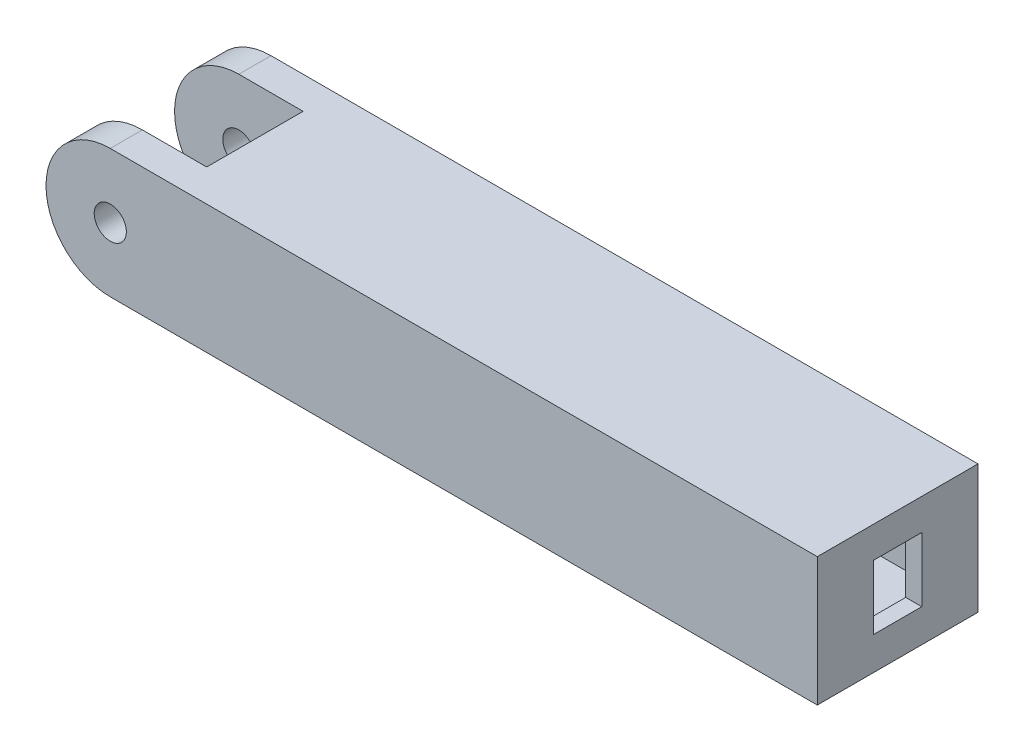
ISO-10303-21;
HEADER;
FILE_DESCRIPTION(('STEP AP214'),'2;1');
FILE_NAME('part.step','',(''),(''),'','','');
FILE_SCHEMA(('AUTOMOTIVE_DESIGN { 1 0 10303 214 1 1 1 1 }'));
ENDSEC;
DATA;
#1=APPLICATION_CONTEXT('core data for automotive mechanical design processes');
#2=APPLICATION_PROTOCOL_DEFINITION('international standard','automotive_design',2000,#1);
#3=PRODUCT_CONTEXT('',#1,'mechanical');
#4=PRODUCT('Part','Part','',(#3));
#5=PRODUCT_RELATED_PRODUCT_CATEGORY('part','',(#4));
#6=PRODUCT_DEFINITION_FORMATION('','',#4);
#7=PRODUCT_DEFINITION_CONTEXT('part definition',#1,'design');
#8=PRODUCT_DEFINITION('design','',#6,#7);
#9=PRODUCT_DEFINITION_SHAPE('','',#8);
#10=(LENGTH_UNIT() NAMED_UNIT(*) SI_UNIT(.MILLI.,.METRE.));
#11=(NAMED_UNIT(*) PLANE_ANGLE_UNIT() SI_UNIT($,.RADIAN.));
#12=(NAMED_UNIT(*) SI_UNIT($,.STERADIAN.) SOLID_ANGLE_UNIT());
#13=UNCERTAINTY_MEASURE_WITH_UNIT(LENGTH_MEASURE(1.E-05),#10,'distance_accuracy_value','');
#14=(GEOMETRIC_REPRESENTATION_CONTEXT(3) GLOBAL_UNCERTAINTY_ASSIGNED_CONTEXT((#13)) GLOBAL_UNIT_ASSIGNED_CONTEXT((#10,
#11,#12)) REPRESENTATION_CONTEXT('',''));
#15=CARTESIAN_POINT('',(0.,0.,0.));
#16=DIRECTION('',(0.,0.,1.));
#17=DIRECTION('',(1.,0.,0.));
#18=AXIS2_PLACEMENT_3D('',#15,#16,#17);
#19=CARTESIAN_POINT('',(-156.373937677054,40.,-19.4050991501417));
#20=DIRECTION('',(1.,0.,0.));
#21=DIRECTION('',(0.,0.,-1.));
#22=AXIS2_PLACEMENT_3D('',#19,#20,#21);
#23=PLANE('',#22);
#24=DIRECTION('',(0.,0.,-1.));
#25=VECTOR('',#24,1.);
#26=CARTESIAN_POINT('',(-156.373937677054,30.2662259821717,-1.90509915014166));
#27=LINE('',#26,#25);
#28=CARTESIAN_POINT('',(-156.373937677054,30.2662259821717,13.0949008498583));
#29=VERTEX_POINT('',#28);
#30=CARTESIAN_POINT('',(-156.373937677054,30.2662259821717,-1.90509915014166));
#31=VERTEX_POINT('',#30);
#32=EDGE_CURVE('E233',#29,#31,#27,.T.);
#33=ORIENTED_EDGE('',*,*,#32,.F.);
#34=DIRECTION('',(0.,1.,0.));
#35=VECTOR('',#34,1.);
#36=CARTESIAN_POINT('',(-156.373937677054,30.2662259821717,13.0949008498583));
#37=LINE('',#36,#35);
#38=CARTESIAN_POINT('',(-156.373937677054,10.2662259821717,13.0949008498583));
#39=VERTEX_POINT('',#38);
#40=EDGE_CURVE('E56',#39,#29,#37,.T.);
#41=ORIENTED_EDGE('',*,*,#40,.F.);
#42=DIRECTION('',(0.,0.,1.));
#43=VECTOR('',#42,1.);
#44=CARTESIAN_POINT('',(-156.373937677054,10.2662259821717,-1.90509915014165));
#45=LINE('',#44,#43);
#46=CARTESIAN_POINT('',(-156.373937677054,10.2662259821717,-1.90509915014165));
#47=VERTEX_POINT('',#46);
#48=EDGE_CURVE('E217',#47,#39,#45,.T.);
#49=ORIENTED_EDGE('',*,*,#48,.F.);
#50=DIRECTION('',(0.,-1.,0.));
#51=VECTOR('',#50,1.);
#52=CARTESIAN_POINT('',(-156.373937677054,30.2662259821717,-1.90509915014166));
#53=LINE('',#52,#51);
#54=EDGE_CURVE('E221',#31,#47,#53,.T.);
#55=ORIENTED_EDGE('',*,*,#54,.F.);
#56=EDGE_LOOP('',(#33,#41,#49,#55));
#57=FACE_BOUND('',#56,.T.);
#58=DIRECTION('',(0.,-1.,0.));
#59=VECTOR('',#58,1.);
#60=CARTESIAN_POINT('',(-156.373937677054,40.,20.5949008498583));
#61=LINE('',#60,#59);
#62=CARTESIAN_POINT('',(-156.373937677054,40.,20.5949008498583));
#63=VERTEX_POINT('',#62);
#64=CARTESIAN_POINT('',(-156.373937677054,0.,20.5949008498583));
#65=VERTEX_POINT('',#64);
#66=EDGE_CURVE('E265',#63,#65,#61,.T.);
#67=ORIENTED_EDGE('',*,*,#66,.F.);
#68=DIRECTION('',(0.,0.,1.));
#69=VECTOR('',#68,1.);
#70=CARTESIAN_POINT('',(-156.373937677054,40.,-19.4050991501417));
#71=LINE('',#70,#69);
#72=CARTESIAN_POINT('',(-156.373937677054,40.,-9.40509915014166));
#73=VERTEX_POINT('',#72);
#74=EDGE_CURVE('E329',#73,#63,#71,.T.);
#75=ORIENTED_EDGE('',*,*,#74,.F.);
#76=DIRECTION('',(0.,1.,0.));
#77=VECTOR('',#76,1.);
#78=CARTESIAN_POINT('',(-156.373937677054,40.,-9.40509915014166));
#79=LINE('',#78,#77);
#80=CARTESIAN_POINT('',(-156.373937677054,0.,-9.40509915014166));
#81=VERTEX_POINT('',#80);
#82=EDGE_CURVE('E276',#81,#73,#79,.T.);
#83=ORIENTED_EDGE('',*,*,#82,.F.);
#84=DIRECTION('',(0.,0.,1.));
#85=VECTOR('',#84,1.);
#86=CARTESIAN_POINT('',(-156.373937677054,0.,-19.4050991501417));
#87=LINE('',#86,#85);
#88=EDGE_CURVE('E328',#81,#65,#87,.T.);
#89=ORIENTED_EDGE('',*,*,#88,.T.);
#90=EDGE_LOOP('',(#67,#75,#83,#89));
#91=FACE_BOUND('',#90,.T.);
#92=ADVANCED_FACE('F39',(#57,#91),#23,.F.);
#93=CARTESIAN_POINT('',(-156.373937677054,40.,30.5949008498583));
#94=DIRECTION('',(0.,0.,-1.));
#95=DIRECTION('',(-1.,0.,0.));
#96=AXIS2_PLACEMENT_3D('',#93,#94,#95);
#97=PLANE('',#96);
#98=CARTESIAN_POINT('',(-176.373937677054,20.,30.5949008498583));
#99=DIRECTION('',(0.,0.,1.));
#100=DIRECTION('',(1.,0.,0.));
#101=AXIS2_PLACEMENT_3D('',#98,#99,#100);
#102=CIRCLE('',#101,5.00000000000002);
#103=CARTESIAN_POINT('',(-171.373937677054,20.,30.5949008498583));
#104=VERTEX_POINT('',#103);
#105=EDGE_CURVE('E757',#104,#104,#102,.T.);
#106=ORIENTED_EDGE('',*,*,#105,.F.);
#107=EDGE_LOOP('',(#106));
#108=FACE_BOUND('',#107,.T.);
#109=CARTESIAN_POINT('',(-176.373937677054,20.,30.5949008498583));
#110=DIRECTION('',(0.,0.,-1.));
#111=DIRECTION('',(-1.,0.,0.));
#112=AXIS2_PLACEMENT_3D('',#109,#110,#111);
#113=CIRCLE('',#112,20.);
#114=CARTESIAN_POINT('',(-176.373937677054,40.,30.5949008498583));
#115=VERTEX_POINT('',#114);
#116=CARTESIAN_POINT('',(-196.373937677054,20.,30.5949008498583));
#117=VERTEX_POINT('',#116);
#118=EDGE_CURVE('E364',#115,#117,#113,.F.);
#119=ORIENTED_EDGE('',*,*,#118,.T.);
#120=CARTESIAN_POINT('',(-176.373937677054,20.,30.5949008498583));
#121=DIRECTION('',(0.,0.,-1.));
#122=DIRECTION('',(-1.,0.,0.));
#123=AXIS2_PLACEMENT_3D('',#120,#121,#122);
#124=CIRCLE('',#123,20.);
#125=CARTESIAN_POINT('',(-176.373937677054,0.,30.5949008498583));
#126=VERTEX_POINT('',#125);
#127=EDGE_CURVE('E367',#117,#126,#124,.F.);
#128=ORIENTED_EDGE('',*,*,#127,.T.);
#129=DIRECTION('',(1.,0.,0.));
#130=VECTOR('',#129,1.);
#131=CARTESIAN_POINT('',(-156.373937677054,0.,30.5949008498583));
#132=LINE('',#131,#130);
#133=CARTESIAN_POINT('',(43.6260623229462,0.,30.5949008498583));
#134=VERTEX_POINT('',#133);
#135=EDGE_CURVE('E348',#126,#134,#132,.T.);
#136=ORIENTED_EDGE('',*,*,#135,.T.);
#137=DIRECTION('',(0.,-1.,0.));
#138=VECTOR('',#137,1.);
#139=CARTESIAN_POINT('',(43.6260623229462,40.,30.5949008498583));
#140=LINE('',#139,#138);
#141=CARTESIAN_POINT('',(43.6260623229462,40.,30.5949008498583));
#142=VERTEX_POINT('',#141);
#143=EDGE_CURVE('E360',#142,#134,#140,.T.);
#144=ORIENTED_EDGE('',*,*,#143,.F.);
#145=DIRECTION('',(1.,0.,0.));
#146=VECTOR('',#145,1.);
#147=CARTESIAN_POINT('',(-156.373937677054,40.,30.5949008498583));
#148=LINE('',#147,#146);
#149=EDGE_CURVE('E333',#115,#142,#148,.T.);
#150=ORIENTED_EDGE('',*,*,#149,.F.);
#151=EDGE_LOOP('',(#119,#128,#136,#144,#150));
#152=FACE_BOUND('',#151,.T.);
#153=ADVANCED_FACE('F438',(#108,#152),#97,.F.);
#154=CARTESIAN_POINT('',(43.6260623229462,40.,-19.4050991501417));
#155=DIRECTION('',(-1.,0.,0.));
#156=DIRECTION('',(0.,0.,1.));
#157=AXIS2_PLACEMENT_3D('',#154,#155,#156);
#158=PLANE('',#157);
#159=DIRECTION('',(0.,0.,1.));
#160=VECTOR('',#159,1.);
#161=CARTESIAN_POINT('',(43.6260623229462,10.2662259821717,-1.90509915014165));
#162=LINE('',#161,#160);
#163=CARTESIAN_POINT('',(43.6260623229462,10.2662259821717,-1.90509915014165));
#164=VERTEX_POINT('',#163);
#165=CARTESIAN_POINT('',(43.6260623229462,10.2662259821717,13.0949008498583));
#166=VERTEX_POINT('',#165);
#167=EDGE_CURVE('E215',#164,#166,#162,.T.);
#168=ORIENTED_EDGE('',*,*,#167,.T.);
#169=DIRECTION('',(0.,1.,0.));
#170=VECTOR('',#169,1.);
#171=CARTESIAN_POINT('',(43.6260623229462,30.2662259821717,13.0949008498583));
#172=LINE('',#171,#170);
#173=CARTESIAN_POINT('',(43.6260623229462,30.2662259821717,13.0949008498583));
#174=VERTEX_POINT('',#173);
#175=EDGE_CURVE('E196',#166,#174,#172,.T.);
#176=ORIENTED_EDGE('',*,*,#175,.T.);
#177=DIRECTION('',(0.,0.,-1.));
#178=VECTOR('',#177,1.);
#179=CARTESIAN_POINT('',(43.6260623229462,30.2662259821717,-1.90509915014166));
#180=LINE('',#179,#178);
#181=CARTESIAN_POINT('',(43.6260623229462,30.2662259821717,-1.90509915014166));
#182=VERTEX_POINT('',#181);
#183=EDGE_CURVE('E206',#174,#182,#180,.T.);
#184=ORIENTED_EDGE('',*,*,#183,.T.);
#185=DIRECTION('',(0.,-1.,0.));
#186=VECTOR('',#185,1.);
#187=CARTESIAN_POINT('',(43.6260623229462,30.2662259821717,-1.90509915014166));
#188=LINE('',#187,#186);
#189=EDGE_CURVE('E64',#182,#164,#188,.T.);
#190=ORIENTED_EDGE('',*,*,#189,.T.);
#191=EDGE_LOOP('',(#168,#176,#184,#190));
#192=FACE_BOUND('',#191,.T.);
#193=DIRECTION('',(0.,0.,-1.));
#194=VECTOR('',#193,1.);
#195=CARTESIAN_POINT('',(43.6260623229462,0.,-19.4050991501417));
#196=LINE('',#195,#194);
#197=CARTESIAN_POINT('',(43.6260623229462,0.,-19.4050991501417));
#198=VERTEX_POINT('',#197);
#199=EDGE_CURVE('E351',#134,#198,#196,.T.);
#200=ORIENTED_EDGE('',*,*,#199,.T.);
#201=DIRECTION('',(0.,-1.,0.));
#202=VECTOR('',#201,1.);
#203=CARTESIAN_POINT('',(43.6260623229462,40.,-19.4050991501417));
#204=LINE('',#203,#202);
#205=CARTESIAN_POINT('',(43.6260623229462,40.,-19.4050991501417));
#206=VERTEX_POINT('',#205);
#207=EDGE_CURVE('E344',#206,#198,#204,.T.);
#208=ORIENTED_EDGE('',*,*,#207,.F.);
#209=DIRECTION('',(0.,0.,-1.));
#210=VECTOR('',#209,1.);
#211=CARTESIAN_POINT('',(43.6260623229462,40.,-19.4050991501417));
#212=LINE('',#211,#210);
#213=EDGE_CURVE('E337',#142,#206,#212,.T.);
#214=ORIENTED_EDGE('',*,*,#213,.F.);
#215=ORIENTED_EDGE('',*,*,#143,.T.);
#216=EDGE_LOOP('',(#200,#208,#214,#215));
#217=FACE_BOUND('',#216,.T.);
#218=ADVANCED_FACE('F212',(#192,#217),#158,.F.);
#219=CARTESIAN_POINT('',(-156.373937677054,40.,-19.4050991501417));
#220=DIRECTION('',(0.,0.,1.));
#221=DIRECTION('',(1.,0.,0.));
#222=AXIS2_PLACEMENT_3D('',#219,#220,#221);
#223=PLANE('',#222);
#224=CARTESIAN_POINT('',(-176.373937677054,20.,-19.4050991501417));
#225=DIRECTION('',(0.,0.,1.));
#226=DIRECTION('',(1.,0.,0.));
#227=AXIS2_PLACEMENT_3D('',#224,#225,#226);
#228=CIRCLE('',#227,5.00000000000002);
#229=CARTESIAN_POINT('',(-171.373937677054,20.,-19.4050991501417));
#230=VERTEX_POINT('',#229);
#231=EDGE_CURVE('E749',#230,#230,#228,.T.);
#232=ORIENTED_EDGE('',*,*,#231,.T.);
#233=EDGE_LOOP('',(#232));
#234=FACE_BOUND('',#233,.T.);
#235=CARTESIAN_POINT('',(-176.373937677054,20.,-19.4050991501417));
#236=DIRECTION('',(0.,0.,1.));
#237=DIRECTION('',(1.,0.,0.));
#238=AXIS2_PLACEMENT_3D('',#235,#236,#237);
#239=CIRCLE('',#238,20.);
#240=CARTESIAN_POINT('',(-176.373937677054,0.,-19.4050991501417));
#241=VERTEX_POINT('',#240);
#242=CARTESIAN_POINT('',(-196.373937677054,20.,-19.4050991501417));
#243=VERTEX_POINT('',#242);
#244=EDGE_CURVE('E390',#241,#243,#239,.F.);
#245=ORIENTED_EDGE('',*,*,#244,.T.);
#246=CARTESIAN_POINT('',(-176.373937677054,20.,-19.4050991501417));
#247=DIRECTION('',(0.,0.,1.));
#248=DIRECTION('',(1.,0.,0.));
#249=AXIS2_PLACEMENT_3D('',#246,#247,#248);
#250=CIRCLE('',#249,20.);
#251=CARTESIAN_POINT('',(-176.373937677054,40.,-19.4050991501417));
#252=VERTEX_POINT('',#251);
#253=EDGE_CURVE('E393',#243,#252,#250,.F.);
#254=ORIENTED_EDGE('',*,*,#253,.T.);
#255=DIRECTION('',(-1.,0.,0.));
#256=VECTOR('',#255,1.);
#257=CARTESIAN_POINT('',(-156.373937677054,40.,-19.4050991501417));
#258=LINE('',#257,#256);
#259=EDGE_CURVE('E340',#206,#252,#258,.T.);
#260=ORIENTED_EDGE('',*,*,#259,.F.);
#261=ORIENTED_EDGE('',*,*,#207,.T.);
#262=DIRECTION('',(-1.,0.,0.));
#263=VECTOR('',#262,1.);
#264=CARTESIAN_POINT('',(-156.373937677054,0.,-19.4050991501417));
#265=LINE('',#264,#263);
#266=EDGE_CURVE('E334',#198,#241,#265,.T.);
#267=ORIENTED_EDGE('',*,*,#266,.T.);
#268=EDGE_LOOP('',(#245,#254,#260,#261,#267));
#269=FACE_BOUND('',#268,.T.);
#270=ADVANCED_FACE('F500',(#234,#269),#223,.F.);
#271=CARTESIAN_POINT('',(0.,40.,0.));
#272=DIRECTION('',(0.,1.,0.));
#273=DIRECTION('',(0.,0.,1.));
#274=AXIS2_PLACEMENT_3D('',#271,#272,#273);
#275=PLANE('',#274);
#276=DIRECTION('',(1.,0.,0.));
#277=VECTOR('',#276,1.);
#278=CARTESIAN_POINT('',(-196.373937677054,40.,20.5949008498583));
#279=LINE('',#278,#277);
#280=CARTESIAN_POINT('',(-176.373937677054,40.,20.5949008498583));
#281=VERTEX_POINT('',#280);
#282=EDGE_CURVE('E273',#281,#63,#279,.T.);
#283=ORIENTED_EDGE('',*,*,#282,.F.);
#284=DIRECTION('',(0.,0.,-1.));
#285=VECTOR('',#284,1.);
#286=CARTESIAN_POINT('',(-176.373937677054,40.,30.5949008498583));
#287=LINE('',#286,#285);
#288=EDGE_CURVE('E387',#281,#115,#287,.F.);
#289=ORIENTED_EDGE('',*,*,#288,.T.);
#290=ORIENTED_EDGE('',*,*,#149,.T.);
#291=ORIENTED_EDGE('',*,*,#213,.T.);
#292=ORIENTED_EDGE('',*,*,#259,.T.);
#293=DIRECTION('',(0.,0.,-1.));
#294=VECTOR('',#293,1.);
#295=CARTESIAN_POINT('',(-176.373937677054,40.,0.));
#296=LINE('',#295,#294);
#297=CARTESIAN_POINT('',(-176.373937677054,40.,-9.40509915014166));
#298=VERTEX_POINT('',#297);
#299=EDGE_CURVE('E383',#252,#298,#296,.F.);
#300=ORIENTED_EDGE('',*,*,#299,.T.);
#301=DIRECTION('',(1.,0.,0.));
#302=VECTOR('',#301,1.);
#303=CARTESIAN_POINT('',(-196.373937677054,40.,-9.40509915014166));
#304=LINE('',#303,#302);
#305=EDGE_CURVE('E280',#298,#73,#304,.T.);
#306=ORIENTED_EDGE('',*,*,#305,.T.);
#307=ORIENTED_EDGE('',*,*,#74,.T.);
#308=EDGE_LOOP('',(#283,#289,#290,#291,#292,#300,#306,#307));
#309=FACE_BOUND('',#308,.T.);
#310=ADVANCED_FACE('F472',(#309),#275,.T.);
#311=CARTESIAN_POINT('',(0.,0.,0.));
#312=DIRECTION('',(0.,1.,0.));
#313=DIRECTION('',(0.,0.,1.));
#314=AXIS2_PLACEMENT_3D('',#311,#312,#313);
#315=PLANE('',#314);
#316=ORIENTED_EDGE('',*,*,#135,.F.);
#317=DIRECTION('',(0.,0.,1.));
#318=VECTOR('',#317,1.);
#319=CARTESIAN_POINT('',(-176.373937677054,0.,0.));
#320=LINE('',#319,#318);
#321=CARTESIAN_POINT('',(-176.373937677054,0.,20.5949008498583));
#322=VERTEX_POINT('',#321);
#323=EDGE_CURVE('E373',#126,#322,#320,.F.);
#324=ORIENTED_EDGE('',*,*,#323,.T.);
#325=DIRECTION('',(1.,0.,0.));
#326=VECTOR('',#325,1.);
#327=CARTESIAN_POINT('',(-196.373937677054,0.,20.5949008498583));
#328=LINE('',#327,#326);
#329=EDGE_CURVE('E269',#322,#65,#328,.T.);
#330=ORIENTED_EDGE('',*,*,#329,.T.);
#331=ORIENTED_EDGE('',*,*,#88,.F.);
#332=DIRECTION('',(1.,0.,0.));
#333=VECTOR('',#332,1.);
#334=CARTESIAN_POINT('',(-196.373937677054,0.,-9.40509915014165));
#335=LINE('',#334,#333);
#336=CARTESIAN_POINT('',(-176.373937677054,0.,-9.40509915014165));
#337=VERTEX_POINT('',#336);
#338=EDGE_CURVE('E283',#337,#81,#335,.T.);
#339=ORIENTED_EDGE('',*,*,#338,.F.);
#340=DIRECTION('',(0.,0.,1.));
#341=VECTOR('',#340,1.);
#342=CARTESIAN_POINT('',(-176.373937677054,0.,-19.4050991501417));
#343=LINE('',#342,#341);
#344=EDGE_CURVE('E370',#337,#241,#343,.F.);
#345=ORIENTED_EDGE('',*,*,#344,.T.);
#346=ORIENTED_EDGE('',*,*,#266,.F.);
#347=ORIENTED_EDGE('',*,*,#199,.F.);
#348=EDGE_LOOP('',(#316,#324,#330,#331,#339,#345,#346,#347));
#349=FACE_BOUND('',#348,.T.);
#350=ADVANCED_FACE('F482',(#349),#315,.F.);
#351=CARTESIAN_POINT('',(-196.373937677054,40.,-9.40509915014166));
#352=DIRECTION('',(0.,0.,-1.));
#353=DIRECTION('',(0.,1.,0.));
#354=AXIS2_PLACEMENT_3D('',#351,#352,#353);
#355=PLANE('',#354);
#356=CARTESIAN_POINT('',(-176.373937677054,20.,-9.40509915014166));
#357=DIRECTION('',(0.,0.,-1.));
#358=DIRECTION('',(0.,1.,0.));
#359=AXIS2_PLACEMENT_3D('',#356,#357,#358);
#360=CIRCLE('',#359,5.00000000000002);
#361=CARTESIAN_POINT('',(-176.373937677054,25.,-9.40509915014166));
#362=VERTEX_POINT('',#361);
#363=EDGE_CURVE('E224',#362,#362,#360,.T.);
#364=ORIENTED_EDGE('',*,*,#363,.T.);
#365=EDGE_LOOP('',(#364));
#366=FACE_BOUND('',#365,.T.);
#367=ORIENTED_EDGE('',*,*,#305,.F.);
#368=CARTESIAN_POINT('',(-176.373937677054,20.,-9.40509915014166));
#369=DIRECTION('',(0.,0.,-1.));
#370=DIRECTION('',(0.,1.,0.));
#371=AXIS2_PLACEMENT_3D('',#368,#369,#370);
#372=CIRCLE('',#371,20.);
#373=CARTESIAN_POINT('',(-196.373937677054,20.,-9.40509915014166));
#374=VERTEX_POINT('',#373);
#375=EDGE_CURVE('E399',#298,#374,#372,.F.);
#376=ORIENTED_EDGE('',*,*,#375,.T.);
#377=CARTESIAN_POINT('',(-176.373937677054,20.,-9.40509915014166));
#378=DIRECTION('',(0.,0.,-1.));
#379=DIRECTION('',(0.,1.,0.));
#380=AXIS2_PLACEMENT_3D('',#377,#378,#379);
#381=CIRCLE('',#380,20.);
#382=EDGE_CURVE('E396',#374,#337,#381,.F.);
#383=ORIENTED_EDGE('',*,*,#382,.T.);
#384=ORIENTED_EDGE('',*,*,#338,.T.);
#385=ORIENTED_EDGE('',*,*,#82,.T.);
#386=EDGE_LOOP('',(#367,#376,#383,#384,#385));
#387=FACE_BOUND('',#386,.T.);
#388=ADVANCED_FACE('F475',(#366,#387),#355,.F.);
#389=CARTESIAN_POINT('',(-196.373937677054,40.,20.5949008498583));
#390=DIRECTION('',(0.,0.,1.));
#391=DIRECTION('',(0.,-1.,0.));
#392=AXIS2_PLACEMENT_3D('',#389,#390,#391);
#393=PLANE('',#392);
#394=CARTESIAN_POINT('',(-176.373937677054,20.,20.5949008498583));
#395=DIRECTION('',(0.,0.,1.));
#396=DIRECTION('',(0.,-1.,0.));
#397=AXIS2_PLACEMENT_3D('',#394,#395,#396);
#398=CIRCLE('',#397,5.00000000000002);
#399=CARTESIAN_POINT('',(-176.373937677054,15.,20.5949008498583));
#400=VERTEX_POINT('',#399);
#401=EDGE_CURVE('E43',#400,#400,#398,.T.);
#402=ORIENTED_EDGE('',*,*,#401,.T.);
#403=EDGE_LOOP('',(#402));
#404=FACE_BOUND('',#403,.T.);
#405=ORIENTED_EDGE('',*,*,#329,.F.);
#406=CARTESIAN_POINT('',(-176.373937677054,20.,20.5949008498583));
#407=DIRECTION('',(0.,0.,1.));
#408=DIRECTION('',(0.,-1.,0.));
#409=AXIS2_PLACEMENT_3D('',#406,#407,#408);
#410=CIRCLE('',#409,20.);
#411=CARTESIAN_POINT('',(-196.373937677054,20.,20.5949008498583));
#412=VERTEX_POINT('',#411);
#413=EDGE_CURVE('E380',#322,#412,#410,.F.);
#414=ORIENTED_EDGE('',*,*,#413,.T.);
#415=CARTESIAN_POINT('',(-176.373937677054,20.,20.5949008498583));
#416=DIRECTION('',(0.,0.,1.));
#417=DIRECTION('',(0.,-1.,0.));
#418=AXIS2_PLACEMENT_3D('',#415,#416,#417);
#419=CIRCLE('',#418,20.);
#420=EDGE_CURVE('E377',#412,#281,#419,.F.);
#421=ORIENTED_EDGE('',*,*,#420,.T.);
#422=ORIENTED_EDGE('',*,*,#282,.T.);
#423=ORIENTED_EDGE('',*,*,#66,.T.);
#424=EDGE_LOOP('',(#405,#414,#421,#422,#423));
#425=FACE_BOUND('',#424,.T.);
#426=ADVANCED_FACE('F456',(#404,#425),#393,.F.);
#427=CARTESIAN_POINT('',(-176.373937677054,20.,0.));
#428=DIRECTION('',(0.,0.,1.));
#429=DIRECTION('',(1.,0.,0.));
#430=AXIS2_PLACEMENT_3D('',#427,#428,#429);
#431=CYLINDRICAL_SURFACE('',#430,20.);
#432=ORIENTED_EDGE('',*,*,#288,.F.);
#433=ORIENTED_EDGE('',*,*,#420,.F.);
#434=DIRECTION('',(0.,0.,-1.));
#435=VECTOR('',#434,1.);
#436=CARTESIAN_POINT('',(-196.373937677054,20.,20.5949008498583));
#437=LINE('',#436,#435);
#438=EDGE_CURVE('E270',#117,#412,#437,.T.);
#439=ORIENTED_EDGE('',*,*,#438,.F.);
#440=ORIENTED_EDGE('',*,*,#118,.F.);
#441=EDGE_LOOP('',(#432,#433,#439,#440));
#442=FACE_BOUND('',#441,.T.);
#443=ADVANCED_FACE('F453',(#442),#431,.T.);
#444=CARTESIAN_POINT('',(-176.373937677054,20.,0.));
#445=DIRECTION('',(0.,0.,1.));
#446=DIRECTION('',(1.,0.,0.));
#447=AXIS2_PLACEMENT_3D('',#444,#445,#446);
#448=CYLINDRICAL_SURFACE('',#447,20.);
#449=ORIENTED_EDGE('',*,*,#413,.F.);
#450=ORIENTED_EDGE('',*,*,#323,.F.);
#451=ORIENTED_EDGE('',*,*,#127,.F.);
#452=ORIENTED_EDGE('',*,*,#438,.T.);
#453=EDGE_LOOP('',(#449,#450,#451,#452));
#454=FACE_BOUND('',#453,.T.);
#455=ADVANCED_FACE('F450',(#454),#448,.T.);
#456=CARTESIAN_POINT('',(-176.373937677054,20.,0.));
#457=DIRECTION('',(0.,0.,-1.));
#458=DIRECTION('',(-1.,0.,0.));
#459=AXIS2_PLACEMENT_3D('',#456,#457,#458);
#460=CYLINDRICAL_SURFACE('',#459,20.);
#461=ORIENTED_EDGE('',*,*,#344,.F.);
#462=ORIENTED_EDGE('',*,*,#382,.F.);
#463=DIRECTION('',(0.,0.,1.));
#464=VECTOR('',#463,1.);
#465=CARTESIAN_POINT('',(-196.373937677054,20.,-9.40509915014165));
#466=LINE('',#465,#464);
#467=EDGE_CURVE('E264',#243,#374,#466,.T.);
#468=ORIENTED_EDGE('',*,*,#467,.F.);
#469=ORIENTED_EDGE('',*,*,#244,.F.);
#470=EDGE_LOOP('',(#461,#462,#468,#469));
#471=FACE_BOUND('',#470,.T.);
#472=ADVANCED_FACE('F41',(#471),#460,.T.);
#473=CARTESIAN_POINT('',(-176.373937677054,20.,0.));
#474=DIRECTION('',(0.,0.,-1.));
#475=DIRECTION('',(-1.,0.,0.));
#476=AXIS2_PLACEMENT_3D('',#473,#474,#475);
#477=CYLINDRICAL_SURFACE('',#476,20.);
#478=ORIENTED_EDGE('',*,*,#375,.F.);
#479=ORIENTED_EDGE('',*,*,#299,.F.);
#480=ORIENTED_EDGE('',*,*,#253,.F.);
#481=ORIENTED_EDGE('',*,*,#467,.T.);
#482=EDGE_LOOP('',(#478,#479,#480,#481));
#483=FACE_BOUND('',#482,.T.);
#484=ADVANCED_FACE('F432',(#483),#477,.T.);
#485=CARTESIAN_POINT('',(43.6260623229462,30.2662259821717,-1.90509915014166));
#486=DIRECTION('',(0.,1.,0.));
#487=DIRECTION('',(0.,0.,1.));
#488=AXIS2_PLACEMENT_3D('',#485,#486,#487);
#489=PLANE('',#488);
#490=DIRECTION('',(0.,0.,-1.));
#491=VECTOR('',#490,1.);
#492=CARTESIAN_POINT('',(38.6260623229462,30.2662259821717,-19.4050991501417));
#493=LINE('',#492,#491);
#494=CARTESIAN_POINT('',(38.6260623229462,30.2662259821717,13.0949008498583));
#495=VERTEX_POINT('',#494);
#496=CARTESIAN_POINT('',(38.6260623229462,30.2662259821717,-1.90509915014166));
#497=VERTEX_POINT('',#496);
#498=EDGE_CURVE('E402',#495,#497,#493,.T.);
#499=ORIENTED_EDGE('',*,*,#498,.T.);
#500=DIRECTION('',(-1.,0.,0.));
#501=VECTOR('',#500,1.);
#502=CARTESIAN_POINT('',(43.6260623229462,30.2662259821717,-1.90509915014166));
#503=LINE('',#502,#501);
#504=EDGE_CURVE('E208',#182,#497,#503,.T.);
#505=ORIENTED_EDGE('',*,*,#504,.F.);
#506=ORIENTED_EDGE('',*,*,#183,.F.);
#507=DIRECTION('',(-1.,0.,0.));
#508=VECTOR('',#507,1.);
#509=CARTESIAN_POINT('',(43.6260623229462,30.2662259821717,13.0949008498583));
#510=LINE('',#509,#508);
#511=EDGE_CURVE('E191',#174,#495,#510,.T.);
#512=ORIENTED_EDGE('',*,*,#511,.T.);
#513=EDGE_LOOP('',(#499,#505,#506,#512));
#514=FACE_BOUND('',#513,.T.);
#515=ADVANCED_FACE('F207',(#514),#489,.F.);
#516=CARTESIAN_POINT('',(43.6260623229462,30.2662259821717,-1.90509915014166));
#517=DIRECTION('',(0.,0.,-1.));
#518=DIRECTION('',(0.,1.,0.));
#519=AXIS2_PLACEMENT_3D('',#516,#517,#518);
#520=PLANE('',#519);
#521=DIRECTION('',(0.,-1.,0.));
#522=VECTOR('',#521,1.);
#523=CARTESIAN_POINT('',(38.6260623229462,35.,-1.90509915014166));
#524=LINE('',#523,#522);
#525=CARTESIAN_POINT('',(38.6260623229462,10.2662259821717,-1.90509915014165));
#526=VERTEX_POINT('',#525);
#527=EDGE_CURVE('E411',#497,#526,#524,.T.);
#528=ORIENTED_EDGE('',*,*,#527,.T.);
#529=DIRECTION('',(-1.,0.,0.));
#530=VECTOR('',#529,1.);
#531=CARTESIAN_POINT('',(43.6260623229462,10.2662259821717,-1.90509915014165));
#532=LINE('',#531,#530);
#533=EDGE_CURVE('E245',#164,#526,#532,.T.);
#534=ORIENTED_EDGE('',*,*,#533,.F.);
#535=ORIENTED_EDGE('',*,*,#189,.F.);
#536=ORIENTED_EDGE('',*,*,#504,.T.);
#537=EDGE_LOOP('',(#528,#534,#535,#536));
#538=FACE_BOUND('',#537,.T.);
#539=ADVANCED_FACE('F422',(#538),#520,.F.);
#540=CARTESIAN_POINT('',(43.6260623229462,10.2662259821717,-1.90509915014165));
#541=DIRECTION('',(0.,-1.,0.));
#542=DIRECTION('',(0.,0.,-1.));
#543=AXIS2_PLACEMENT_3D('',#540,#541,#542);
#544=PLANE('',#543);
#545=DIRECTION('',(0.,0.,1.));
#546=VECTOR('',#545,1.);
#547=CARTESIAN_POINT('',(38.6260623229462,10.2662259821717,-19.4050991501417));
#548=LINE('',#547,#546);
#549=CARTESIAN_POINT('',(38.6260623229462,10.2662259821717,13.0949008498583));
#550=VERTEX_POINT('',#549);
#551=EDGE_CURVE('E49',#526,#550,#548,.T.);
#552=ORIENTED_EDGE('',*,*,#551,.T.);
#553=DIRECTION('',(-1.,0.,0.));
#554=VECTOR('',#553,1.);
#555=CARTESIAN_POINT('',(43.6260623229462,10.2662259821717,13.0949008498583));
#556=LINE('',#555,#554);
#557=EDGE_CURVE('E240',#166,#550,#556,.T.);
#558=ORIENTED_EDGE('',*,*,#557,.F.);
#559=ORIENTED_EDGE('',*,*,#167,.F.);
#560=ORIENTED_EDGE('',*,*,#533,.T.);
#561=EDGE_LOOP('',(#552,#558,#559,#560));
#562=FACE_BOUND('',#561,.T.);
#563=ADVANCED_FACE('F417',(#562),#544,.F.);
#564=CARTESIAN_POINT('',(43.6260623229462,30.2662259821717,13.0949008498583));
#565=DIRECTION('',(0.,0.,1.));
#566=DIRECTION('',(0.,-1.,0.));
#567=AXIS2_PLACEMENT_3D('',#564,#565,#566);
#568=PLANE('',#567);
#569=DIRECTION('',(0.,1.,0.));
#570=VECTOR('',#569,1.);
#571=CARTESIAN_POINT('',(38.6260623229462,35.,13.0949008498583));
#572=LINE('',#571,#570);
#573=EDGE_CURVE('E11',#550,#495,#572,.T.);
#574=ORIENTED_EDGE('',*,*,#573,.T.);
#575=ORIENTED_EDGE('',*,*,#511,.F.);
#576=ORIENTED_EDGE('',*,*,#175,.F.);
#577=ORIENTED_EDGE('',*,*,#557,.T.);
#578=EDGE_LOOP('',(#574,#575,#576,#577));
#579=FACE_BOUND('',#578,.T.);
#580=ADVANCED_FACE('F193',(#579),#568,.F.);
#581=DIRECTION('',(0.,-1.,0.));
#582=VECTOR('',#581,1.);
#583=CARTESIAN_POINT('',(-151.373937677054,35.,13.0949008498583));
#584=LINE('',#583,#582);
#585=CARTESIAN_POINT('',(-151.373937677054,30.2662259821717,13.0949008498583));
#586=VERTEX_POINT('',#585);
#587=CARTESIAN_POINT('',(-151.373937677054,10.2662259821717,13.0949008498583));
#588=VERTEX_POINT('',#587);
#589=EDGE_CURVE('E261',#586,#588,#584,.T.);
#590=ORIENTED_EDGE('',*,*,#589,.T.);
#591=EDGE_CURVE('E244',#588,#39,#556,.T.);
#592=ORIENTED_EDGE('',*,*,#591,.T.);
#593=ORIENTED_EDGE('',*,*,#40,.T.);
#594=EDGE_CURVE('E203',#586,#29,#510,.T.);
#595=ORIENTED_EDGE('',*,*,#594,.F.);
#596=EDGE_LOOP('',(#590,#592,#593,#595));
#597=FACE_BOUND('',#596,.T.);
#598=ADVANCED_FACE('F544',(#597),#568,.F.);
#599=DIRECTION('',(0.,0.,-1.));
#600=VECTOR('',#599,1.);
#601=CARTESIAN_POINT('',(-151.373937677054,10.2662259821717,-19.4050991501417));
#602=LINE('',#601,#600);
#603=CARTESIAN_POINT('',(-151.373937677054,10.2662259821717,-1.90509915014165));
#604=VERTEX_POINT('',#603);
#605=EDGE_CURVE('E258',#588,#604,#602,.T.);
#606=ORIENTED_EDGE('',*,*,#605,.T.);
#607=EDGE_CURVE('E249',#604,#47,#532,.T.);
#608=ORIENTED_EDGE('',*,*,#607,.T.);
#609=ORIENTED_EDGE('',*,*,#48,.T.);
#610=ORIENTED_EDGE('',*,*,#591,.F.);
#611=EDGE_LOOP('',(#606,#608,#609,#610));
#612=FACE_BOUND('',#611,.T.);
#613=ADVANCED_FACE('F431',(#612),#544,.F.);
#614=DIRECTION('',(0.,1.,0.));
#615=VECTOR('',#614,1.);
#616=CARTESIAN_POINT('',(-151.373937677054,35.,-1.90509915014166));
#617=LINE('',#616,#615);
#618=CARTESIAN_POINT('',(-151.373937677054,30.2662259821717,-1.90509915014166));
#619=VERTEX_POINT('',#618);
#620=EDGE_CURVE('E254',#604,#619,#617,.T.);
#621=ORIENTED_EDGE('',*,*,#620,.T.);
#622=EDGE_CURVE('E202',#619,#31,#503,.T.);
#623=ORIENTED_EDGE('',*,*,#622,.T.);
#624=ORIENTED_EDGE('',*,*,#54,.T.);
#625=ORIENTED_EDGE('',*,*,#607,.F.);
#626=EDGE_LOOP('',(#621,#623,#624,#625));
#627=FACE_BOUND('',#626,.T.);
#628=ADVANCED_FACE('F425',(#627),#520,.F.);
#629=DIRECTION('',(0.,0.,1.));
#630=VECTOR('',#629,1.);
#631=CARTESIAN_POINT('',(-151.373937677054,30.2662259821717,-19.4050991501417));
#632=LINE('',#631,#630);
#633=EDGE_CURVE('E243',#619,#586,#632,.T.);
#634=ORIENTED_EDGE('',*,*,#633,.T.);
#635=ORIENTED_EDGE('',*,*,#594,.T.);
#636=ORIENTED_EDGE('',*,*,#32,.T.);
#637=ORIENTED_EDGE('',*,*,#622,.F.);
#638=EDGE_LOOP('',(#634,#635,#636,#637));
#639=FACE_BOUND('',#638,.T.);
#640=ADVANCED_FACE('F434',(#639),#489,.F.);
#641=CARTESIAN_POINT('',(-151.373937677054,35.,-19.4050991501417));
#642=DIRECTION('',(1.,0.,0.));
#643=DIRECTION('',(0.,0.,-1.));
#644=AXIS2_PLACEMENT_3D('',#641,#642,#643);
#645=PLANE('',#644);
#646=ORIENTED_EDGE('',*,*,#589,.F.);
#647=ORIENTED_EDGE('',*,*,#633,.F.);
#648=ORIENTED_EDGE('',*,*,#620,.F.);
#649=ORIENTED_EDGE('',*,*,#605,.F.);
#650=EDGE_LOOP('',(#646,#647,#648,#649));
#651=FACE_BOUND('',#650,.T.);
#652=DIRECTION('',(0.,0.,1.));
#653=VECTOR('',#652,1.);
#654=CARTESIAN_POINT('',(-151.373937677054,5.,-19.4050991501417));
#655=LINE('',#654,#653);
#656=CARTESIAN_POINT('',(-151.373937677054,5.,-14.4050991501417));
#657=VERTEX_POINT('',#656);
#658=CARTESIAN_POINT('',(-151.373937677054,5.,25.5949008498583));
#659=VERTEX_POINT('',#658);
#660=EDGE_CURVE('E286',#657,#659,#655,.T.);
#661=ORIENTED_EDGE('',*,*,#660,.F.);
#662=DIRECTION('',(0.,-1.,0.));
#663=VECTOR('',#662,1.);
#664=CARTESIAN_POINT('',(-151.373937677054,35.,-14.4050991501417));
#665=LINE('',#664,#663);
#666=CARTESIAN_POINT('',(-151.373937677054,35.,-14.4050991501417));
#667=VERTEX_POINT('',#666);
#668=EDGE_CURVE('E301',#667,#657,#665,.T.);
#669=ORIENTED_EDGE('',*,*,#668,.F.);
#670=DIRECTION('',(0.,0.,1.));
#671=VECTOR('',#670,1.);
#672=CARTESIAN_POINT('',(-151.373937677054,35.,-19.4050991501417));
#673=LINE('',#672,#671);
#674=CARTESIAN_POINT('',(-151.373937677054,35.,25.5949008498583));
#675=VERTEX_POINT('',#674);
#676=EDGE_CURVE('E287',#667,#675,#673,.T.);
#677=ORIENTED_EDGE('',*,*,#676,.T.);
#678=DIRECTION('',(0.,-1.,0.));
#679=VECTOR('',#678,1.);
#680=CARTESIAN_POINT('',(-151.373937677054,35.,25.5949008498583));
#681=LINE('',#680,#679);
#682=EDGE_CURVE('E324',#675,#659,#681,.T.);
#683=ORIENTED_EDGE('',*,*,#682,.T.);
#684=EDGE_LOOP('',(#661,#669,#677,#683));
#685=FACE_BOUND('',#684,.T.);
#686=ADVANCED_FACE('F514',(#651,#685),#645,.T.);
#687=CARTESIAN_POINT('',(-156.373937677054,35.,25.5949008498583));
#688=DIRECTION('',(0.,0.,-1.));
#689=DIRECTION('',(-1.,0.,0.));
#690=AXIS2_PLACEMENT_3D('',#687,#688,#689);
#691=PLANE('',#690);
#692=DIRECTION('',(1.,0.,0.));
#693=VECTOR('',#692,1.);
#694=CARTESIAN_POINT('',(-156.373937677054,5.,25.5949008498583));
#695=LINE('',#694,#693);
#696=CARTESIAN_POINT('',(38.6260623229462,5.,25.5949008498583));
#697=VERTEX_POINT('',#696);
#698=EDGE_CURVE('E305',#659,#697,#695,.T.);
#699=ORIENTED_EDGE('',*,*,#698,.F.);
#700=ORIENTED_EDGE('',*,*,#682,.F.);
#701=DIRECTION('',(1.,0.,0.));
#702=VECTOR('',#701,1.);
#703=CARTESIAN_POINT('',(-156.373937677054,35.,25.5949008498583));
#704=LINE('',#703,#702);
#705=CARTESIAN_POINT('',(38.6260623229462,35.,25.5949008498583));
#706=VERTEX_POINT('',#705);
#707=EDGE_CURVE('E291',#675,#706,#704,.T.);
#708=ORIENTED_EDGE('',*,*,#707,.T.);
#709=DIRECTION('',(0.,-1.,0.));
#710=VECTOR('',#709,1.);
#711=CARTESIAN_POINT('',(38.6260623229462,35.,25.5949008498583));
#712=LINE('',#711,#710);
#713=EDGE_CURVE('E320',#706,#697,#712,.T.);
#714=ORIENTED_EDGE('',*,*,#713,.T.);
#715=EDGE_LOOP('',(#699,#700,#708,#714));
#716=FACE_BOUND('',#715,.T.);
#717=ADVANCED_FACE('F517',(#716),#691,.T.);
#718=CARTESIAN_POINT('',(38.6260623229462,35.,-19.4050991501417));
#719=DIRECTION('',(-1.,0.,0.));
#720=DIRECTION('',(0.,0.,1.));
#721=AXIS2_PLACEMENT_3D('',#718,#719,#720);
#722=PLANE('',#721);
#723=ORIENTED_EDGE('',*,*,#573,.F.);
#724=ORIENTED_EDGE('',*,*,#551,.F.);
#725=ORIENTED_EDGE('',*,*,#527,.F.);
#726=ORIENTED_EDGE('',*,*,#498,.F.);
#727=EDGE_LOOP('',(#723,#724,#725,#726));
#728=FACE_BOUND('',#727,.T.);
#729=DIRECTION('',(0.,0.,-1.));
#730=VECTOR('',#729,1.);
#731=CARTESIAN_POINT('',(38.6260623229462,5.,-19.4050991501417));
#732=LINE('',#731,#730);
#733=CARTESIAN_POINT('',(38.6260623229462,5.,-14.4050991501417));
#734=VERTEX_POINT('',#733);
#735=EDGE_CURVE('E308',#697,#734,#732,.T.);
#736=ORIENTED_EDGE('',*,*,#735,.F.);
#737=ORIENTED_EDGE('',*,*,#713,.F.);
#738=DIRECTION('',(0.,0.,-1.));
#739=VECTOR('',#738,1.);
#740=CARTESIAN_POINT('',(38.6260623229462,35.,-19.4050991501417));
#741=LINE('',#740,#739);
#742=CARTESIAN_POINT('',(38.6260623229462,35.,-14.4050991501417));
#743=VERTEX_POINT('',#742);
#744=EDGE_CURVE('E295',#706,#743,#741,.T.);
#745=ORIENTED_EDGE('',*,*,#744,.T.);
#746=DIRECTION('',(0.,-1.,0.));
#747=VECTOR('',#746,1.);
#748=CARTESIAN_POINT('',(38.6260623229462,35.,-14.4050991501417));
#749=LINE('',#748,#747);
#750=EDGE_CURVE('E316',#743,#734,#749,.T.);
#751=ORIENTED_EDGE('',*,*,#750,.T.);
#752=EDGE_LOOP('',(#736,#737,#745,#751));
#753=FACE_BOUND('',#752,.T.);
#754=ADVANCED_FACE('F420',(#728,#753),#722,.T.);
#755=CARTESIAN_POINT('',(-156.373937677054,35.,-14.4050991501417));
#756=DIRECTION('',(0.,0.,1.));
#757=DIRECTION('',(1.,0.,0.));
#758=AXIS2_PLACEMENT_3D('',#755,#756,#757);
#759=PLANE('',#758);
#760=DIRECTION('',(-1.,0.,0.));
#761=VECTOR('',#760,1.);
#762=CARTESIAN_POINT('',(-156.373937677054,5.,-14.4050991501417));
#763=LINE('',#762,#761);
#764=EDGE_CURVE('E292',#734,#657,#763,.T.);
#765=ORIENTED_EDGE('',*,*,#764,.F.);
#766=ORIENTED_EDGE('',*,*,#750,.F.);
#767=DIRECTION('',(-1.,0.,0.));
#768=VECTOR('',#767,1.);
#769=CARTESIAN_POINT('',(-156.373937677054,35.,-14.4050991501417));
#770=LINE('',#769,#768);
#771=EDGE_CURVE('E298',#743,#667,#770,.T.);
#772=ORIENTED_EDGE('',*,*,#771,.T.);
#773=ORIENTED_EDGE('',*,*,#668,.T.);
#774=EDGE_LOOP('',(#765,#766,#772,#773));
#775=FACE_BOUND('',#774,.T.);
#776=ADVANCED_FACE('F524',(#775),#759,.T.);
#777=CARTESIAN_POINT('',(0.,35.,0.));
#778=DIRECTION('',(0.,1.,0.));
#779=DIRECTION('',(0.,0.,1.));
#780=AXIS2_PLACEMENT_3D('',#777,#778,#779);
#781=PLANE('',#780);
#782=ORIENTED_EDGE('',*,*,#676,.F.);
#783=ORIENTED_EDGE('',*,*,#771,.F.);
#784=ORIENTED_EDGE('',*,*,#744,.F.);
#785=ORIENTED_EDGE('',*,*,#707,.F.);
#786=EDGE_LOOP('',(#782,#783,#784,#785));
#787=FACE_BOUND('',#786,.T.);
#788=ADVANCED_FACE('F527',(#787),#781,.F.);
#789=CARTESIAN_POINT('',(0.,5.,0.));
#790=DIRECTION('',(0.,1.,0.));
#791=DIRECTION('',(0.,0.,1.));
#792=AXIS2_PLACEMENT_3D('',#789,#790,#791);
#793=PLANE('',#792);
#794=ORIENTED_EDGE('',*,*,#660,.T.);
#795=ORIENTED_EDGE('',*,*,#698,.T.);
#796=ORIENTED_EDGE('',*,*,#735,.T.);
#797=ORIENTED_EDGE('',*,*,#764,.T.);
#798=EDGE_LOOP('',(#794,#795,#796,#797));
#799=FACE_BOUND('',#798,.T.);
#800=ADVANCED_FACE('F529',(#799),#793,.T.);
#801=CARTESIAN_POINT('',(-176.373937677054,20.,-19.4050991501417));
#802=DIRECTION('',(0.,0.,1.));
#803=DIRECTION('',(1.,0.,0.));
#804=AXIS2_PLACEMENT_3D('',#801,#802,#803);
#805=CYLINDRICAL_SURFACE('',#804,5.00000000000002);
#806=ORIENTED_EDGE('',*,*,#105,.T.);
#807=EDGE_LOOP('',(#806));
#808=FACE_BOUND('',#807,.T.);
#809=ORIENTED_EDGE('',*,*,#401,.F.);
#810=EDGE_LOOP('',(#809));
#811=FACE_BOUND('',#810,.T.);
#812=ADVANCED_FACE('F532',(#808,#811),#805,.F.);
#813=ORIENTED_EDGE('',*,*,#231,.F.);
#814=EDGE_LOOP('',(#813));
#815=FACE_BOUND('',#814,.T.);
#816=ORIENTED_EDGE('',*,*,#363,.F.);
#817=EDGE_LOOP('',(#816));
#818=FACE_BOUND('',#817,.T.);
#819=ADVANCED_FACE('F603',(#815,#818),#805,.F.);
#820=CLOSED_SHELL('',(#92,#153,#218,#270,#310,#350,#388,#426,#443,#455,#472,#484,#515,#539,#563,
#580,#598,#613,#628,#640,#686,#717,#754,#776,#788,#800,#812,#819));
#821=MANIFOLD_SOLID_BREP('B2',#820);
#822=ADVANCED_BREP_SHAPE_REPRESENTATION('',(#18,#821),#14);
#823=SHAPE_DEFINITION_REPRESENTATION(#9,#822);
ENDSEC;
END-ISO-10303-21;
